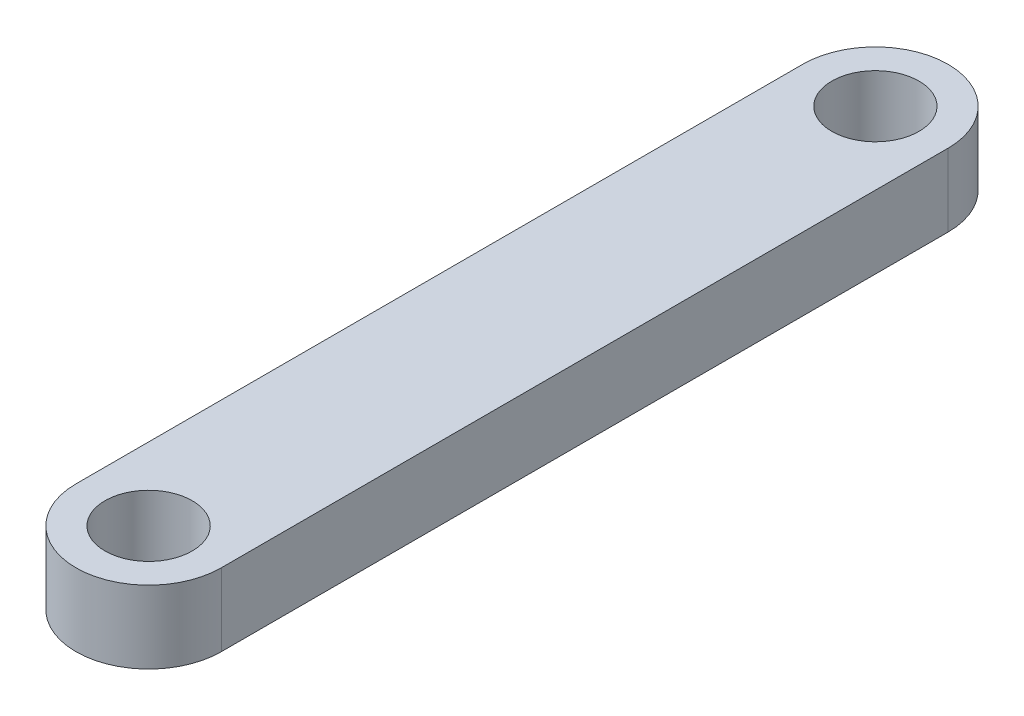
ISO-10303-21;
HEADER;
FILE_DESCRIPTION(('STEP AP214'),'2;1');
FILE_NAME('part.step','',(''),(''),'','','');
FILE_SCHEMA(('AUTOMOTIVE_DESIGN { 1 0 10303 214 1 1 1 1 }'));
ENDSEC;
DATA;
#1=APPLICATION_CONTEXT('core data for automotive mechanical design processes');
#2=APPLICATION_PROTOCOL_DEFINITION('international standard','automotive_design',2000,#1);
#3=PRODUCT_CONTEXT('',#1,'mechanical');
#4=PRODUCT('Part','Part','',(#3));
#5=PRODUCT_RELATED_PRODUCT_CATEGORY('part','',(#4));
#6=PRODUCT_DEFINITION_FORMATION('','',#4);
#7=PRODUCT_DEFINITION_CONTEXT('part definition',#1,'design');
#8=PRODUCT_DEFINITION('design','',#6,#7);
#9=PRODUCT_DEFINITION_SHAPE('','',#8);
#10=(LENGTH_UNIT() NAMED_UNIT(*) SI_UNIT(.MILLI.,.METRE.));
#11=(NAMED_UNIT(*) PLANE_ANGLE_UNIT() SI_UNIT($,.RADIAN.));
#12=(NAMED_UNIT(*) SI_UNIT($,.STERADIAN.) SOLID_ANGLE_UNIT());
#13=UNCERTAINTY_MEASURE_WITH_UNIT(LENGTH_MEASURE(1.E-05),#10,'distance_accuracy_value','');
#14=(GEOMETRIC_REPRESENTATION_CONTEXT(3) GLOBAL_UNCERTAINTY_ASSIGNED_CONTEXT((#13)) GLOBAL_UNIT_ASSIGNED_CONTEXT((#10,
#11,#12)) REPRESENTATION_CONTEXT('',''));
#15=CARTESIAN_POINT('',(0.,0.,0.));
#16=DIRECTION('',(0.,0.,1.));
#17=DIRECTION('',(1.,0.,0.));
#18=AXIS2_PLACEMENT_3D('',#15,#16,#17);
#19=CARTESIAN_POINT('',(0.,10.,0.));
#20=DIRECTION('',(0.,-1.,0.));
#21=DIRECTION('',(0.,0.,-1.));
#22=AXIS2_PLACEMENT_3D('',#19,#20,#21);
#23=PLANE('',#22);
#24=CARTESIAN_POINT('',(0.,10.,0.));
#25=DIRECTION('',(0.,1.,0.));
#26=DIRECTION('',(0.,0.,-1.));
#27=AXIS2_PLACEMENT_3D('',#24,#25,#26);
#28=CIRCLE('',#27,10.);
#29=CARTESIAN_POINT('',(-10.,10.,0.));
#30=VERTEX_POINT('',#29);
#31=CARTESIAN_POINT('',(10.,10.,0.));
#32=VERTEX_POINT('',#31);
#33=EDGE_CURVE('E92',#30,#32,#28,.T.);
#34=ORIENTED_EDGE('',*,*,#33,.T.);
#35=DIRECTION('',(0.,0.,-1.));
#36=VECTOR('',#35,1.);
#37=CARTESIAN_POINT('',(10.,10.,0.));
#38=LINE('',#37,#36);
#39=CARTESIAN_POINT('',(9.99999999999999,10.,-100.));
#40=VERTEX_POINT('',#39);
#41=EDGE_CURVE('E87',#32,#40,#38,.T.);
#42=ORIENTED_EDGE('',*,*,#41,.T.);
#43=CARTESIAN_POINT('',(0.,10.,-100.));
#44=DIRECTION('',(0.,1.,0.));
#45=DIRECTION('',(0.,0.,1.));
#46=AXIS2_PLACEMENT_3D('',#43,#44,#45);
#47=CIRCLE('',#46,10.);
#48=CARTESIAN_POINT('',(-10.,10.,-100.));
#49=VERTEX_POINT('',#48);
#50=EDGE_CURVE('E90',#40,#49,#47,.T.);
#51=ORIENTED_EDGE('',*,*,#50,.T.);
#52=DIRECTION('',(0.,0.,1.));
#53=VECTOR('',#52,1.);
#54=CARTESIAN_POINT('',(-10.,10.,0.));
#55=LINE('',#54,#53);
#56=EDGE_CURVE('E57',#49,#30,#55,.T.);
#57=ORIENTED_EDGE('',*,*,#56,.T.);
#58=EDGE_LOOP('',(#34,#42,#51,#57));
#59=FACE_BOUND('',#58,.T.);
#60=CARTESIAN_POINT('',(0.,10.,-100.));
#61=DIRECTION('',(0.,1.,0.));
#62=DIRECTION('',(0.,0.,1.));
#63=AXIS2_PLACEMENT_3D('',#60,#61,#62);
#64=CIRCLE('',#63,6.);
#65=CARTESIAN_POINT('',(0.,10.,-94.));
#66=VERTEX_POINT('',#65);
#67=EDGE_CURVE('E112',#66,#66,#64,.T.);
#68=ORIENTED_EDGE('',*,*,#67,.F.);
#69=EDGE_LOOP('',(#68));
#70=FACE_BOUND('',#69,.T.);
#71=CARTESIAN_POINT('',(0.,10.,0.));
#72=DIRECTION('',(0.,1.,0.));
#73=DIRECTION('',(0.,0.,1.));
#74=AXIS2_PLACEMENT_3D('',#71,#72,#73);
#75=CIRCLE('',#74,6.);
#76=CARTESIAN_POINT('',(0.,10.,6.));
#77=VERTEX_POINT('',#76);
#78=EDGE_CURVE('E134',#77,#77,#75,.T.);
#79=ORIENTED_EDGE('',*,*,#78,.F.);
#80=EDGE_LOOP('',(#79));
#81=FACE_BOUND('',#80,.T.);
#82=ADVANCED_FACE('F39',(#59,#70,#81),#23,.F.);
#83=CARTESIAN_POINT('',(0.,0.,0.));
#84=DIRECTION('',(0.,-1.,0.));
#85=DIRECTION('',(0.,0.,-1.));
#86=AXIS2_PLACEMENT_3D('',#83,#84,#85);
#87=PLANE('',#86);
#88=CARTESIAN_POINT('',(0.,0.,-100.));
#89=DIRECTION('',(0.,1.,0.));
#90=DIRECTION('',(0.,0.,1.));
#91=AXIS2_PLACEMENT_3D('',#88,#89,#90);
#92=CIRCLE('',#91,6.);
#93=CARTESIAN_POINT('',(0.,0.,-94.));
#94=VERTEX_POINT('',#93);
#95=EDGE_CURVE('E130',#94,#94,#92,.T.);
#96=ORIENTED_EDGE('',*,*,#95,.T.);
#97=EDGE_LOOP('',(#96));
#98=FACE_BOUND('',#97,.T.);
#99=CARTESIAN_POINT('',(0.,0.,0.));
#100=DIRECTION('',(0.,1.,0.));
#101=DIRECTION('',(0.,0.,-1.));
#102=AXIS2_PLACEMENT_3D('',#99,#100,#101);
#103=CIRCLE('',#102,10.);
#104=CARTESIAN_POINT('',(-10.,0.,0.));
#105=VERTEX_POINT('',#104);
#106=CARTESIAN_POINT('',(10.,0.,0.));
#107=VERTEX_POINT('',#106);
#108=EDGE_CURVE('E108',#105,#107,#103,.T.);
#109=ORIENTED_EDGE('',*,*,#108,.F.);
#110=DIRECTION('',(0.,0.,1.));
#111=VECTOR('',#110,1.);
#112=CARTESIAN_POINT('',(-10.,0.,0.));
#113=LINE('',#112,#111);
#114=CARTESIAN_POINT('',(-10.,0.,-100.));
#115=VERTEX_POINT('',#114);
#116=EDGE_CURVE('E80',#115,#105,#113,.T.);
#117=ORIENTED_EDGE('',*,*,#116,.F.);
#118=CARTESIAN_POINT('',(0.,0.,-100.));
#119=DIRECTION('',(0.,1.,0.));
#120=DIRECTION('',(0.,0.,1.));
#121=AXIS2_PLACEMENT_3D('',#118,#119,#120);
#122=CIRCLE('',#121,10.);
#123=CARTESIAN_POINT('',(9.99999999999999,0.,-100.));
#124=VERTEX_POINT('',#123);
#125=EDGE_CURVE('E74',#124,#115,#122,.T.);
#126=ORIENTED_EDGE('',*,*,#125,.F.);
#127=DIRECTION('',(0.,0.,-1.));
#128=VECTOR('',#127,1.);
#129=CARTESIAN_POINT('',(10.,0.,0.));
#130=LINE('',#129,#128);
#131=EDGE_CURVE('E97',#107,#124,#130,.T.);
#132=ORIENTED_EDGE('',*,*,#131,.F.);
#133=EDGE_LOOP('',(#109,#117,#126,#132));
#134=FACE_BOUND('',#133,.T.);
#135=CARTESIAN_POINT('',(0.,0.,0.));
#136=DIRECTION('',(0.,1.,0.));
#137=DIRECTION('',(0.,0.,1.));
#138=AXIS2_PLACEMENT_3D('',#135,#136,#137);
#139=CIRCLE('',#138,6.);
#140=CARTESIAN_POINT('',(0.,0.,6.));
#141=VERTEX_POINT('',#140);
#142=EDGE_CURVE('E138',#141,#141,#139,.T.);
#143=ORIENTED_EDGE('',*,*,#142,.T.);
#144=EDGE_LOOP('',(#143));
#145=FACE_BOUND('',#144,.T.);
#146=ADVANCED_FACE('F125',(#98,#134,#145),#87,.T.);
#147=CARTESIAN_POINT('',(0.,10.,0.));
#148=DIRECTION('',(0.,-1.,0.));
#149=DIRECTION('',(0.,0.,-1.));
#150=AXIS2_PLACEMENT_3D('',#147,#148,#149);
#151=CYLINDRICAL_SURFACE('',#150,10.);
#152=ORIENTED_EDGE('',*,*,#108,.T.);
#153=DIRECTION('',(0.,-1.,0.));
#154=VECTOR('',#153,1.);
#155=CARTESIAN_POINT('',(10.,10.,0.));
#156=LINE('',#155,#154);
#157=EDGE_CURVE('E11',#32,#107,#156,.T.);
#158=ORIENTED_EDGE('',*,*,#157,.F.);
#159=ORIENTED_EDGE('',*,*,#33,.F.);
#160=DIRECTION('',(0.,-1.,0.));
#161=VECTOR('',#160,1.);
#162=CARTESIAN_POINT('',(-10.,10.,0.));
#163=LINE('',#162,#161);
#164=EDGE_CURVE('E104',#30,#105,#163,.T.);
#165=ORIENTED_EDGE('',*,*,#164,.T.);
#166=EDGE_LOOP('',(#152,#158,#159,#165));
#167=FACE_BOUND('',#166,.T.);
#168=ADVANCED_FACE('F41',(#167),#151,.T.);
#169=CARTESIAN_POINT('',(10.,10.,0.));
#170=DIRECTION('',(-1.,0.,0.));
#171=DIRECTION('',(0.,0.,1.));
#172=AXIS2_PLACEMENT_3D('',#169,#170,#171);
#173=PLANE('',#172);
#174=ORIENTED_EDGE('',*,*,#131,.T.);
#175=DIRECTION('',(0.,-1.,0.));
#176=VECTOR('',#175,1.);
#177=CARTESIAN_POINT('',(9.99999999999999,10.,-100.));
#178=LINE('',#177,#176);
#179=EDGE_CURVE('E49',#40,#124,#178,.T.);
#180=ORIENTED_EDGE('',*,*,#179,.F.);
#181=ORIENTED_EDGE('',*,*,#41,.F.);
#182=ORIENTED_EDGE('',*,*,#157,.T.);
#183=EDGE_LOOP('',(#174,#180,#181,#182));
#184=FACE_BOUND('',#183,.T.);
#185=ADVANCED_FACE('F96',(#184),#173,.F.);
#186=CARTESIAN_POINT('',(0.,10.,-100.));
#187=DIRECTION('',(0.,-1.,0.));
#188=DIRECTION('',(0.,0.,-1.));
#189=AXIS2_PLACEMENT_3D('',#186,#187,#188);
#190=CYLINDRICAL_SURFACE('',#189,10.);
#191=ORIENTED_EDGE('',*,*,#125,.T.);
#192=DIRECTION('',(0.,-1.,0.));
#193=VECTOR('',#192,1.);
#194=CARTESIAN_POINT('',(-10.,10.,-100.));
#195=LINE('',#194,#193);
#196=EDGE_CURVE('E99',#49,#115,#195,.T.);
#197=ORIENTED_EDGE('',*,*,#196,.F.);
#198=ORIENTED_EDGE('',*,*,#50,.F.);
#199=ORIENTED_EDGE('',*,*,#179,.T.);
#200=EDGE_LOOP('',(#191,#197,#198,#199));
#201=FACE_BOUND('',#200,.T.);
#202=ADVANCED_FACE('F100',(#201),#190,.T.);
#203=CARTESIAN_POINT('',(-10.,10.,0.));
#204=DIRECTION('',(1.,0.,0.));
#205=DIRECTION('',(0.,0.,-1.));
#206=AXIS2_PLACEMENT_3D('',#203,#204,#205);
#207=PLANE('',#206);
#208=ORIENTED_EDGE('',*,*,#116,.T.);
#209=ORIENTED_EDGE('',*,*,#164,.F.);
#210=ORIENTED_EDGE('',*,*,#56,.F.);
#211=ORIENTED_EDGE('',*,*,#196,.T.);
#212=EDGE_LOOP('',(#208,#209,#210,#211));
#213=FACE_BOUND('',#212,.T.);
#214=ADVANCED_FACE('F122',(#213),#207,.F.);
#215=CARTESIAN_POINT('',(0.,10.,-100.));
#216=DIRECTION('',(0.,-1.,0.));
#217=DIRECTION('',(0.,0.,-1.));
#218=AXIS2_PLACEMENT_3D('',#215,#216,#217);
#219=CYLINDRICAL_SURFACE('',#218,6.);
#220=ORIENTED_EDGE('',*,*,#67,.T.);
#221=EDGE_LOOP('',(#220));
#222=FACE_BOUND('',#221,.T.);
#223=ORIENTED_EDGE('',*,*,#95,.F.);
#224=EDGE_LOOP('',(#223));
#225=FACE_BOUND('',#224,.T.);
#226=ADVANCED_FACE('F157',(#222,#225),#219,.F.);
#227=CARTESIAN_POINT('',(0.,10.,0.));
#228=DIRECTION('',(0.,-1.,0.));
#229=DIRECTION('',(0.,0.,-1.));
#230=AXIS2_PLACEMENT_3D('',#227,#228,#229);
#231=CYLINDRICAL_SURFACE('',#230,6.);
#232=ORIENTED_EDGE('',*,*,#78,.T.);
#233=EDGE_LOOP('',(#232));
#234=FACE_BOUND('',#233,.T.);
#235=ORIENTED_EDGE('',*,*,#142,.F.);
#236=EDGE_LOOP('',(#235));
#237=FACE_BOUND('',#236,.T.);
#238=ADVANCED_FACE('F146',(#234,#237),#231,.F.);
#239=CLOSED_SHELL('',(#82,#146,#168,#185,#202,#214,#226,#238));
#240=MANIFOLD_SOLID_BREP('B2',#239);
#241=ADVANCED_BREP_SHAPE_REPRESENTATION('',(#18,#240),#14);
#242=SHAPE_DEFINITION_REPRESENTATION(#9,#241);
ENDSEC;
END-ISO-10303-21;
